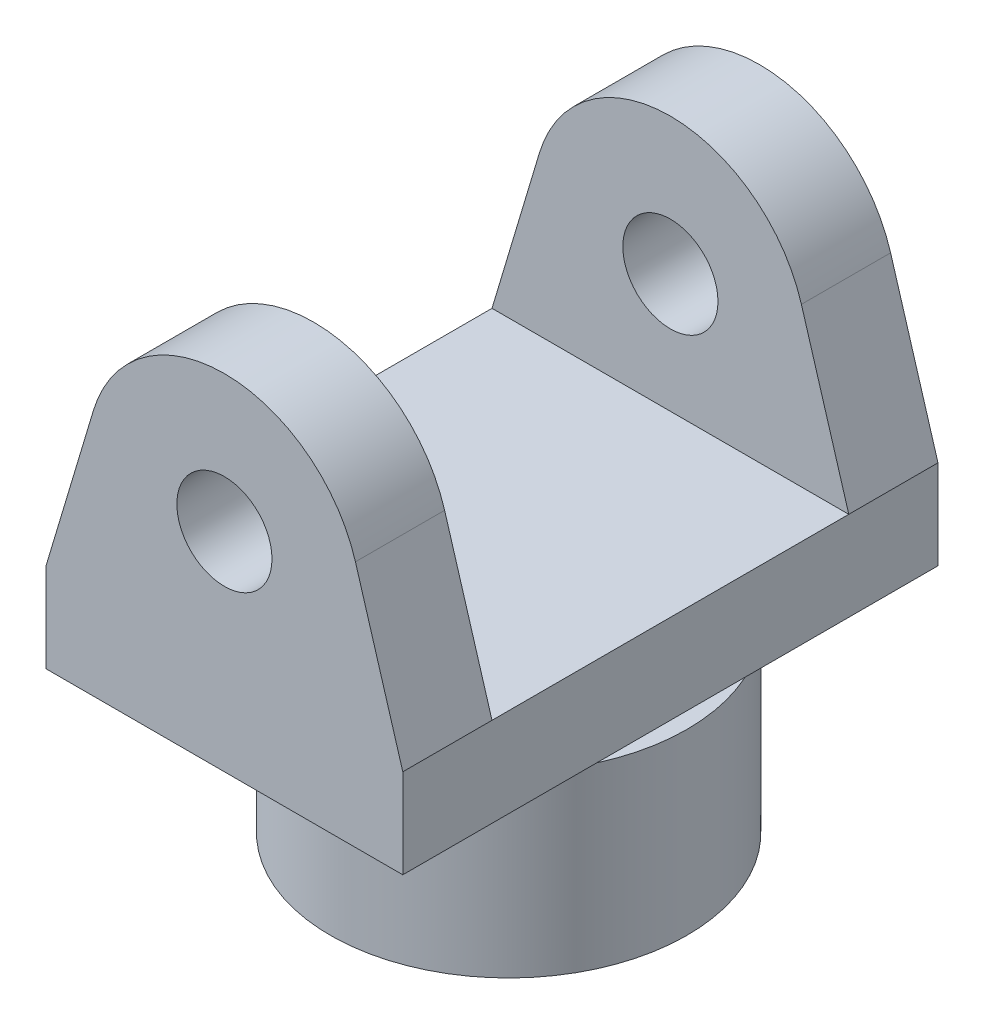
ISO-10303-21;
HEADER;
FILE_DESCRIPTION(('STEP AP214'),'2;1');
FILE_NAME('part.step','',(''),(''),'','','');
FILE_SCHEMA(('AUTOMOTIVE_DESIGN { 1 0 10303 214 1 1 1 1 }'));
ENDSEC;
DATA;
#1=APPLICATION_CONTEXT('core data for automotive mechanical design processes');
#2=APPLICATION_PROTOCOL_DEFINITION('international standard','automotive_design',2000,#1);
#3=PRODUCT_CONTEXT('',#1,'mechanical');
#4=PRODUCT('Part','Part','',(#3));
#5=PRODUCT_RELATED_PRODUCT_CATEGORY('part','',(#4));
#6=PRODUCT_DEFINITION_FORMATION('','',#4);
#7=PRODUCT_DEFINITION_CONTEXT('part definition',#1,'design');
#8=PRODUCT_DEFINITION('design','',#6,#7);
#9=PRODUCT_DEFINITION_SHAPE('','',#8);
#10=(LENGTH_UNIT() NAMED_UNIT(*) SI_UNIT(.MILLI.,.METRE.));
#11=(NAMED_UNIT(*) PLANE_ANGLE_UNIT() SI_UNIT($,.RADIAN.));
#12=(NAMED_UNIT(*) SI_UNIT($,.STERADIAN.) SOLID_ANGLE_UNIT());
#13=UNCERTAINTY_MEASURE_WITH_UNIT(LENGTH_MEASURE(1.E-05),#10,'distance_accuracy_value','');
#14=(GEOMETRIC_REPRESENTATION_CONTEXT(3) GLOBAL_UNCERTAINTY_ASSIGNED_CONTEXT((#13)) GLOBAL_UNIT_ASSIGNED_CONTEXT((#10,
#11,#12)) REPRESENTATION_CONTEXT('',''));
#15=CARTESIAN_POINT('',(0.,0.,0.));
#16=DIRECTION('',(0.,0.,1.));
#17=DIRECTION('',(1.,0.,0.));
#18=AXIS2_PLACEMENT_3D('',#15,#16,#17);
#19=CARTESIAN_POINT('',(0.,-20.,90.));
#20=DIRECTION('',(0.,1.,0.));
#21=DIRECTION('',(0.,0.,1.));
#22=AXIS2_PLACEMENT_3D('',#19,#20,#21);
#23=PLANE('',#22);
#24=DIRECTION('',(0.,0.,-1.));
#25=VECTOR('',#24,1.);
#26=CARTESIAN_POINT('',(-30.,-20.,90.));
#27=LINE('',#26,#25);
#28=CARTESIAN_POINT('',(-30.,-20.,75.));
#29=VERTEX_POINT('',#28);
#30=CARTESIAN_POINT('',(-30.,-20.,15.));
#31=VERTEX_POINT('',#30);
#32=EDGE_CURVE('E274',#29,#31,#27,.T.);
#33=ORIENTED_EDGE('',*,*,#32,.F.);
#34=DIRECTION('',(1.,0.,0.));
#35=VECTOR('',#34,1.);
#36=CARTESIAN_POINT('',(0.,-20.,75.));
#37=LINE('',#36,#35);
#38=CARTESIAN_POINT('',(30.,-20.,75.));
#39=VERTEX_POINT('',#38);
#40=EDGE_CURVE('E226',#29,#39,#37,.T.);
#41=ORIENTED_EDGE('',*,*,#40,.T.);
#42=DIRECTION('',(0.,0.,-1.));
#43=VECTOR('',#42,1.);
#44=CARTESIAN_POINT('',(30.,-20.,90.));
#45=LINE('',#44,#43);
#46=CARTESIAN_POINT('',(30.,-20.,15.));
#47=VERTEX_POINT('',#46);
#48=EDGE_CURVE('E279',#39,#47,#45,.T.);
#49=ORIENTED_EDGE('',*,*,#48,.T.);
#50=DIRECTION('',(1.,0.,0.));
#51=VECTOR('',#50,1.);
#52=CARTESIAN_POINT('',(0.,-20.,15.));
#53=LINE('',#52,#51);
#54=EDGE_CURVE('E306',#31,#47,#53,.T.);
#55=ORIENTED_EDGE('',*,*,#54,.F.);
#56=EDGE_LOOP('',(#33,#41,#49,#55));
#57=FACE_BOUND('',#56,.T.);
#58=ADVANCED_FACE('F41',(#57),#23,.T.);
#59=CARTESIAN_POINT('',(22.0328983898167,6.59934758472496,15.));
#60=DIRECTION('',(-0.957952103905071,-0.286928155857607,0.));
#61=DIRECTION('',(0.286928155857607,-0.957952103905071,0.));
#62=AXIS2_PLACEMENT_3D('',#59,#60,#61);
#63=PLANE('',#62);
#64=DIRECTION('',(-0.286928155857607,0.957952103905072,0.));
#65=VECTOR('',#64,1.);
#66=CARTESIAN_POINT('',(22.0328983898167,6.59934758472496,0.));
#67=LINE('',#66,#65);
#68=CARTESIAN_POINT('',(30.,-20.,0.));
#69=VERTEX_POINT('',#68);
#70=CARTESIAN_POINT('',(22.0328983898167,6.59934758472497,0.));
#71=VERTEX_POINT('',#70);
#72=EDGE_CURVE('E314',#69,#71,#67,.T.);
#73=ORIENTED_EDGE('',*,*,#72,.T.);
#74=DIRECTION('',(0.,0.,-1.));
#75=VECTOR('',#74,1.);
#76=CARTESIAN_POINT('',(22.0328983898167,6.59934758472497,15.));
#77=LINE('',#76,#75);
#78=CARTESIAN_POINT('',(22.0328983898167,6.59934758472497,15.));
#79=VERTEX_POINT('',#78);
#80=EDGE_CURVE('E45',#79,#71,#77,.T.);
#81=ORIENTED_EDGE('',*,*,#80,.F.);
#82=DIRECTION('',(-0.286928155857607,0.957952103905072,0.));
#83=VECTOR('',#82,1.);
#84=CARTESIAN_POINT('',(22.0328983898167,6.59934758472496,15.));
#85=LINE('',#84,#83);
#86=EDGE_CURVE('E294',#47,#79,#85,.T.);
#87=ORIENTED_EDGE('',*,*,#86,.F.);
#88=DIRECTION('',(0.,0.,-1.));
#89=VECTOR('',#88,1.);
#90=CARTESIAN_POINT('',(30.,-20.,15.));
#91=LINE('',#90,#89);
#92=EDGE_CURVE('E310',#47,#69,#91,.T.);
#93=ORIENTED_EDGE('',*,*,#92,.T.);
#94=EDGE_LOOP('',(#73,#81,#87,#93));
#95=FACE_BOUND('',#94,.T.);
#96=ADVANCED_FACE('F343',(#95),#63,.F.);
#97=CARTESIAN_POINT('',(0.,0.,15.));
#98=DIRECTION('',(0.,0.,-1.));
#99=DIRECTION('',(-1.,0.,0.));
#100=AXIS2_PLACEMENT_3D('',#97,#98,#99);
#101=CYLINDRICAL_SURFACE('',#100,23.);
#102=CARTESIAN_POINT('',(0.,0.,0.));
#103=DIRECTION('',(0.,0.,1.));
#104=DIRECTION('',(1.,0.,0.));
#105=AXIS2_PLACEMENT_3D('',#102,#103,#104);
#106=CIRCLE('',#105,23.);
#107=CARTESIAN_POINT('',(-22.0328983898167,6.59934758472497,0.));
#108=VERTEX_POINT('',#107);
#109=EDGE_CURVE('E318',#71,#108,#106,.T.);
#110=ORIENTED_EDGE('',*,*,#109,.T.);
#111=DIRECTION('',(0.,0.,-1.));
#112=VECTOR('',#111,1.);
#113=CARTESIAN_POINT('',(-22.0328983898167,6.59934758472497,15.));
#114=LINE('',#113,#112);
#115=CARTESIAN_POINT('',(-22.0328983898167,6.59934758472497,15.));
#116=VERTEX_POINT('',#115);
#117=EDGE_CURVE('E330',#116,#108,#114,.T.);
#118=ORIENTED_EDGE('',*,*,#117,.F.);
#119=CARTESIAN_POINT('',(0.,0.,15.));
#120=DIRECTION('',(0.,0.,1.));
#121=DIRECTION('',(1.,0.,0.));
#122=AXIS2_PLACEMENT_3D('',#119,#120,#121);
#123=CIRCLE('',#122,23.);
#124=EDGE_CURVE('E299',#79,#116,#123,.T.);
#125=ORIENTED_EDGE('',*,*,#124,.F.);
#126=ORIENTED_EDGE('',*,*,#80,.T.);
#127=EDGE_LOOP('',(#110,#118,#125,#126));
#128=FACE_BOUND('',#127,.T.);
#129=ADVANCED_FACE('F339',(#128),#101,.T.);
#130=CARTESIAN_POINT('',(-22.0328983898167,6.59934758472496,15.));
#131=DIRECTION('',(-0.957952103905071,0.286928155857607,0.));
#132=DIRECTION('',(-0.286928155857607,-0.957952103905072,0.));
#133=AXIS2_PLACEMENT_3D('',#130,#131,#132);
#134=PLANE('',#133);
#135=DIRECTION('',(0.286928155857607,0.957952103905072,0.));
#136=VECTOR('',#135,1.);
#137=CARTESIAN_POINT('',(-22.0328983898167,6.59934758472496,0.));
#138=LINE('',#137,#136);
#139=CARTESIAN_POINT('',(-30.,-20.,0.));
#140=VERTEX_POINT('',#139);
#141=EDGE_CURVE('E295',#140,#108,#138,.T.);
#142=ORIENTED_EDGE('',*,*,#141,.F.);
#143=DIRECTION('',(0.,0.,-1.));
#144=VECTOR('',#143,1.);
#145=CARTESIAN_POINT('',(-30.,-20.,15.));
#146=LINE('',#145,#144);
#147=EDGE_CURVE('E328',#31,#140,#146,.T.);
#148=ORIENTED_EDGE('',*,*,#147,.F.);
#149=DIRECTION('',(0.286928155857607,0.957952103905072,0.));
#150=VECTOR('',#149,1.);
#151=CARTESIAN_POINT('',(-22.0328983898167,6.59934758472496,15.));
#152=LINE('',#151,#150);
#153=EDGE_CURVE('E302',#31,#116,#152,.T.);
#154=ORIENTED_EDGE('',*,*,#153,.T.);
#155=ORIENTED_EDGE('',*,*,#117,.T.);
#156=EDGE_LOOP('',(#142,#148,#154,#155));
#157=FACE_BOUND('',#156,.T.);
#158=ADVANCED_FACE('F351',(#157),#134,.T.);
#159=CARTESIAN_POINT('',(0.,0.,15.));
#160=DIRECTION('',(0.,0.,-1.));
#161=DIRECTION('',(-1.,0.,0.));
#162=AXIS2_PLACEMENT_3D('',#159,#160,#161);
#163=CYLINDRICAL_SURFACE('',#162,8.);
#164=CARTESIAN_POINT('',(0.,0.,15.));
#165=DIRECTION('',(0.,0.,1.));
#166=DIRECTION('',(1.,0.,0.));
#167=AXIS2_PLACEMENT_3D('',#164,#165,#166);
#168=CIRCLE('',#167,8.);
#169=CARTESIAN_POINT('',(8.,0.,15.));
#170=VERTEX_POINT('',#169);
#171=EDGE_CURVE('E290',#170,#170,#168,.T.);
#172=ORIENTED_EDGE('',*,*,#171,.T.);
#173=EDGE_LOOP('',(#172));
#174=FACE_BOUND('',#173,.T.);
#175=CARTESIAN_POINT('',(0.,0.,0.));
#176=DIRECTION('',(0.,0.,1.));
#177=DIRECTION('',(1.,0.,0.));
#178=AXIS2_PLACEMENT_3D('',#175,#176,#177);
#179=CIRCLE('',#178,8.);
#180=CARTESIAN_POINT('',(8.,0.,0.));
#181=VERTEX_POINT('',#180);
#182=EDGE_CURVE('E288',#181,#181,#179,.T.);
#183=ORIENTED_EDGE('',*,*,#182,.F.);
#184=EDGE_LOOP('',(#183));
#185=FACE_BOUND('',#184,.T.);
#186=ADVANCED_FACE('F43',(#174,#185),#163,.F.);
#187=CARTESIAN_POINT('',(0.,0.,15.));
#188=DIRECTION('',(0.,0.,1.));
#189=DIRECTION('',(1.,0.,0.));
#190=AXIS2_PLACEMENT_3D('',#187,#188,#189);
#191=PLANE('',#190);
#192=ORIENTED_EDGE('',*,*,#171,.F.);
#193=EDGE_LOOP('',(#192));
#194=FACE_BOUND('',#193,.T.);
#195=ORIENTED_EDGE('',*,*,#86,.T.);
#196=ORIENTED_EDGE('',*,*,#124,.T.);
#197=ORIENTED_EDGE('',*,*,#153,.F.);
#198=ORIENTED_EDGE('',*,*,#54,.T.);
#199=EDGE_LOOP('',(#195,#196,#197,#198));
#200=FACE_BOUND('',#199,.T.);
#201=ADVANCED_FACE('F355',(#194,#200),#191,.T.);
#202=CARTESIAN_POINT('',(0.,0.,0.));
#203=DIRECTION('',(0.,0.,1.));
#204=DIRECTION('',(1.,0.,0.));
#205=AXIS2_PLACEMENT_3D('',#202,#203,#204);
#206=PLANE('',#205);
#207=ORIENTED_EDGE('',*,*,#182,.T.);
#208=EDGE_LOOP('',(#207));
#209=FACE_BOUND('',#208,.T.);
#210=ORIENTED_EDGE('',*,*,#72,.F.);
#211=DIRECTION('',(0.,1.,0.));
#212=VECTOR('',#211,1.);
#213=CARTESIAN_POINT('',(30.,0.,0.));
#214=LINE('',#213,#212);
#215=CARTESIAN_POINT('',(30.,-35.,0.));
#216=VERTEX_POINT('',#215);
#217=EDGE_CURVE('E266',#216,#69,#214,.T.);
#218=ORIENTED_EDGE('',*,*,#217,.F.);
#219=DIRECTION('',(1.,0.,0.));
#220=VECTOR('',#219,1.);
#221=CARTESIAN_POINT('',(0.,-35.,0.));
#222=LINE('',#221,#220);
#223=CARTESIAN_POINT('',(-30.,-35.,0.));
#224=VERTEX_POINT('',#223);
#225=EDGE_CURVE('E247',#224,#216,#222,.T.);
#226=ORIENTED_EDGE('',*,*,#225,.F.);
#227=DIRECTION('',(0.,1.,0.));
#228=VECTOR('',#227,1.);
#229=CARTESIAN_POINT('',(-30.,0.,0.));
#230=LINE('',#229,#228);
#231=EDGE_CURVE('E255',#224,#140,#230,.T.);
#232=ORIENTED_EDGE('',*,*,#231,.T.);
#233=ORIENTED_EDGE('',*,*,#141,.T.);
#234=ORIENTED_EDGE('',*,*,#109,.F.);
#235=EDGE_LOOP('',(#210,#218,#226,#232,#233,#234));
#236=FACE_BOUND('',#235,.T.);
#237=ADVANCED_FACE('F347',(#209,#236),#206,.F.);
#238=CARTESIAN_POINT('',(0.,-35.,90.));
#239=DIRECTION('',(0.,1.,0.));
#240=DIRECTION('',(0.,0.,1.));
#241=AXIS2_PLACEMENT_3D('',#238,#239,#240);
#242=PLANE('',#241);
#243=CARTESIAN_POINT('',(2.72086676659588,-35.,44.9176678383733));
#244=DIRECTION('',(0.,-1.,0.));
#245=DIRECTION('',(0.,0.,-1.));
#246=AXIS2_PLACEMENT_3D('',#243,#244,#245);
#247=CIRCLE('',#246,30.);
#248=CARTESIAN_POINT('',(30.,-35.,57.4016131295938));
#249=VERTEX_POINT('',#248);
#250=CARTESIAN_POINT('',(30.,-35.,32.4337225471528));
#251=VERTEX_POINT('',#250);
#252=EDGE_CURVE('E11',#249,#251,#247,.T.);
#253=ORIENTED_EDGE('',*,*,#252,.F.);
#254=DIRECTION('',(0.,0.,-1.));
#255=VECTOR('',#254,1.);
#256=CARTESIAN_POINT('',(30.,-35.,90.));
#257=LINE('',#256,#255);
#258=CARTESIAN_POINT('',(30.,-35.,90.));
#259=VERTEX_POINT('',#258);
#260=EDGE_CURVE('E285',#259,#249,#257,.T.);
#261=ORIENTED_EDGE('',*,*,#260,.F.);
#262=DIRECTION('',(1.,0.,0.));
#263=VECTOR('',#262,1.);
#264=CARTESIAN_POINT('',(0.,-35.,90.));
#265=LINE('',#264,#263);
#266=CARTESIAN_POINT('',(-30.,-35.,90.));
#267=VERTEX_POINT('',#266);
#268=EDGE_CURVE('E250',#267,#259,#265,.T.);
#269=ORIENTED_EDGE('',*,*,#268,.F.);
#270=DIRECTION('',(0.,0.,-1.));
#271=VECTOR('',#270,1.);
#272=CARTESIAN_POINT('',(-30.,-35.,90.));
#273=LINE('',#272,#271);
#274=EDGE_CURVE('E262',#267,#224,#273,.T.);
#275=ORIENTED_EDGE('',*,*,#274,.T.);
#276=ORIENTED_EDGE('',*,*,#225,.T.);
#277=EDGE_CURVE('E284',#251,#216,#257,.T.);
#278=ORIENTED_EDGE('',*,*,#277,.F.);
#279=EDGE_LOOP('',(#253,#261,#269,#275,#276,#278));
#280=FACE_BOUND('',#279,.T.);
#281=ADVANCED_FACE('F387',(#280),#242,.F.);
#282=CARTESIAN_POINT('',(30.,0.,90.));
#283=DIRECTION('',(-1.,0.,0.));
#284=DIRECTION('',(0.,-1.,0.));
#285=AXIS2_PLACEMENT_3D('',#282,#283,#284);
#286=PLANE('',#285);
#287=ORIENTED_EDGE('',*,*,#217,.T.);
#288=ORIENTED_EDGE('',*,*,#92,.F.);
#289=ORIENTED_EDGE('',*,*,#48,.F.);
#290=CARTESIAN_POINT('',(30.,-20.,90.));
#291=VERTEX_POINT('',#290);
#292=EDGE_CURVE('E280',#291,#39,#45,.T.);
#293=ORIENTED_EDGE('',*,*,#292,.F.);
#294=DIRECTION('',(0.,1.,0.));
#295=VECTOR('',#294,1.);
#296=CARTESIAN_POINT('',(30.,0.,90.));
#297=LINE('',#296,#295);
#298=EDGE_CURVE('E254',#259,#291,#297,.T.);
#299=ORIENTED_EDGE('',*,*,#298,.F.);
#300=ORIENTED_EDGE('',*,*,#260,.T.);
#301=EDGE_CURVE('E289',#249,#251,#257,.T.);
#302=ORIENTED_EDGE('',*,*,#301,.T.);
#303=ORIENTED_EDGE('',*,*,#277,.T.);
#304=EDGE_LOOP('',(#287,#288,#289,#293,#299,#300,#302,#303));
#305=FACE_BOUND('',#304,.T.);
#306=ADVANCED_FACE('F362',(#305),#286,.F.);
#307=CARTESIAN_POINT('',(-30.,0.,90.));
#308=DIRECTION('',(-1.,0.,0.));
#309=DIRECTION('',(0.,-1.,0.));
#310=AXIS2_PLACEMENT_3D('',#307,#308,#309);
#311=PLANE('',#310);
#312=ORIENTED_EDGE('',*,*,#231,.F.);
#313=ORIENTED_EDGE('',*,*,#274,.F.);
#314=DIRECTION('',(0.,1.,0.));
#315=VECTOR('',#314,1.);
#316=CARTESIAN_POINT('',(-30.,0.,90.));
#317=LINE('',#316,#315);
#318=CARTESIAN_POINT('',(-30.,-20.,90.));
#319=VERTEX_POINT('',#318);
#320=EDGE_CURVE('E259',#267,#319,#317,.T.);
#321=ORIENTED_EDGE('',*,*,#320,.T.);
#322=EDGE_CURVE('E275',#319,#29,#27,.T.);
#323=ORIENTED_EDGE('',*,*,#322,.T.);
#324=ORIENTED_EDGE('',*,*,#32,.T.);
#325=ORIENTED_EDGE('',*,*,#147,.T.);
#326=EDGE_LOOP('',(#312,#313,#321,#323,#324,#325));
#327=FACE_BOUND('',#326,.T.);
#328=ADVANCED_FACE('F367',(#327),#311,.T.);
#329=CARTESIAN_POINT('',(0.,0.,90.));
#330=DIRECTION('',(0.,0.,1.));
#331=DIRECTION('',(1.,0.,0.));
#332=AXIS2_PLACEMENT_3D('',#329,#330,#331);
#333=PLANE('',#332);
#334=ORIENTED_EDGE('',*,*,#268,.T.);
#335=ORIENTED_EDGE('',*,*,#298,.T.);
#336=DIRECTION('',(-0.286928155857607,0.957952103905072,0.));
#337=VECTOR('',#336,1.);
#338=CARTESIAN_POINT('',(22.0328983898167,6.59934758472497,90.));
#339=LINE('',#338,#337);
#340=CARTESIAN_POINT('',(22.0328983898167,6.59934758472497,90.));
#341=VERTEX_POINT('',#340);
#342=EDGE_CURVE('E233',#291,#341,#339,.T.);
#343=ORIENTED_EDGE('',*,*,#342,.T.);
#344=CARTESIAN_POINT('',(0.,0.,90.));
#345=DIRECTION('',(0.,0.,1.));
#346=DIRECTION('',(1.,0.,0.));
#347=AXIS2_PLACEMENT_3D('',#344,#345,#346);
#348=CIRCLE('',#347,23.);
#349=CARTESIAN_POINT('',(-22.0328983898167,6.59934758472497,90.));
#350=VERTEX_POINT('',#349);
#351=EDGE_CURVE('E237',#341,#350,#348,.T.);
#352=ORIENTED_EDGE('',*,*,#351,.T.);
#353=DIRECTION('',(0.286928155857607,0.957952103905072,0.));
#354=VECTOR('',#353,1.);
#355=CARTESIAN_POINT('',(-22.0328983898167,6.59934758472496,90.));
#356=LINE('',#355,#354);
#357=EDGE_CURVE('E215',#319,#350,#356,.T.);
#358=ORIENTED_EDGE('',*,*,#357,.F.);
#359=ORIENTED_EDGE('',*,*,#320,.F.);
#360=EDGE_LOOP('',(#334,#335,#343,#352,#358,#359));
#361=FACE_BOUND('',#360,.T.);
#362=CARTESIAN_POINT('',(0.,0.,90.));
#363=DIRECTION('',(0.,0.,1.));
#364=DIRECTION('',(1.,0.,0.));
#365=AXIS2_PLACEMENT_3D('',#362,#363,#364);
#366=CIRCLE('',#365,8.);
#367=CARTESIAN_POINT('',(8.,0.,90.));
#368=VERTEX_POINT('',#367);
#369=EDGE_CURVE('E206',#368,#368,#366,.T.);
#370=ORIENTED_EDGE('',*,*,#369,.F.);
#371=EDGE_LOOP('',(#370));
#372=FACE_BOUND('',#371,.T.);
#373=ADVANCED_FACE('F384',(#361,#372),#333,.T.);
#374=CARTESIAN_POINT('',(22.0328983898167,6.59934758472497,75.));
#375=DIRECTION('',(0.957952103905071,0.286928155857607,0.));
#376=DIRECTION('',(-0.286928155857607,0.957952103905071,0.));
#377=AXIS2_PLACEMENT_3D('',#374,#375,#376);
#378=PLANE('',#377);
#379=ORIENTED_EDGE('',*,*,#342,.F.);
#380=ORIENTED_EDGE('',*,*,#292,.T.);
#381=DIRECTION('',(-0.286928155857607,0.957952103905072,0.));
#382=VECTOR('',#381,1.);
#383=CARTESIAN_POINT('',(22.0328983898167,6.59934758472497,75.));
#384=LINE('',#383,#382);
#385=CARTESIAN_POINT('',(22.0328983898167,6.59934758472497,75.));
#386=VERTEX_POINT('',#385);
#387=EDGE_CURVE('E214',#39,#386,#384,.T.);
#388=ORIENTED_EDGE('',*,*,#387,.T.);
#389=DIRECTION('',(0.,0.,1.));
#390=VECTOR('',#389,1.);
#391=CARTESIAN_POINT('',(22.0328983898167,6.59934758472497,75.));
#392=LINE('',#391,#390);
#393=EDGE_CURVE('E229',#386,#341,#392,.T.);
#394=ORIENTED_EDGE('',*,*,#393,.T.);
#395=EDGE_LOOP('',(#379,#380,#388,#394));
#396=FACE_BOUND('',#395,.T.);
#397=ADVANCED_FACE('F381',(#396),#378,.T.);
#398=CARTESIAN_POINT('',(-22.0328983898167,6.59934758472496,75.));
#399=DIRECTION('',(0.957952103905071,-0.286928155857607,0.));
#400=DIRECTION('',(0.286928155857607,0.957952103905072,0.));
#401=AXIS2_PLACEMENT_3D('',#398,#399,#400);
#402=PLANE('',#401);
#403=ORIENTED_EDGE('',*,*,#357,.T.);
#404=DIRECTION('',(0.,0.,1.));
#405=VECTOR('',#404,1.);
#406=CARTESIAN_POINT('',(-22.0328983898167,6.59934758472497,75.));
#407=LINE('',#406,#405);
#408=CARTESIAN_POINT('',(-22.0328983898167,6.59934758472497,75.));
#409=VERTEX_POINT('',#408);
#410=EDGE_CURVE('E244',#409,#350,#407,.T.);
#411=ORIENTED_EDGE('',*,*,#410,.F.);
#412=DIRECTION('',(0.286928155857607,0.957952103905072,0.));
#413=VECTOR('',#412,1.);
#414=CARTESIAN_POINT('',(-22.0328983898167,6.59934758472496,75.));
#415=LINE('',#414,#413);
#416=EDGE_CURVE('E223',#29,#409,#415,.T.);
#417=ORIENTED_EDGE('',*,*,#416,.F.);
#418=ORIENTED_EDGE('',*,*,#322,.F.);
#419=EDGE_LOOP('',(#403,#411,#417,#418));
#420=FACE_BOUND('',#419,.T.);
#421=ADVANCED_FACE('F374',(#420),#402,.F.);
#422=CARTESIAN_POINT('',(0.,0.,75.));
#423=DIRECTION('',(0.,0.,1.));
#424=DIRECTION('',(1.,0.,0.));
#425=AXIS2_PLACEMENT_3D('',#422,#423,#424);
#426=CYLINDRICAL_SURFACE('',#425,8.);
#427=CARTESIAN_POINT('',(0.,0.,75.));
#428=DIRECTION('',(0.,0.,1.));
#429=DIRECTION('',(1.,0.,0.));
#430=AXIS2_PLACEMENT_3D('',#427,#428,#429);
#431=CIRCLE('',#430,8.);
#432=CARTESIAN_POINT('',(8.,0.,75.));
#433=VERTEX_POINT('',#432);
#434=EDGE_CURVE('E210',#433,#433,#431,.T.);
#435=ORIENTED_EDGE('',*,*,#434,.F.);
#436=EDGE_LOOP('',(#435));
#437=FACE_BOUND('',#436,.T.);
#438=ORIENTED_EDGE('',*,*,#369,.T.);
#439=EDGE_LOOP('',(#438));
#440=FACE_BOUND('',#439,.T.);
#441=ADVANCED_FACE('F480',(#437,#440),#426,.F.);
#442=CARTESIAN_POINT('',(0.,0.,75.));
#443=DIRECTION('',(0.,0.,1.));
#444=DIRECTION('',(1.,0.,0.));
#445=AXIS2_PLACEMENT_3D('',#442,#443,#444);
#446=CYLINDRICAL_SURFACE('',#445,23.);
#447=ORIENTED_EDGE('',*,*,#351,.F.);
#448=ORIENTED_EDGE('',*,*,#393,.F.);
#449=CARTESIAN_POINT('',(0.,0.,75.));
#450=DIRECTION('',(0.,0.,1.));
#451=DIRECTION('',(1.,0.,0.));
#452=AXIS2_PLACEMENT_3D('',#449,#450,#451);
#453=CIRCLE('',#452,23.);
#454=EDGE_CURVE('E219',#386,#409,#453,.T.);
#455=ORIENTED_EDGE('',*,*,#454,.T.);
#456=ORIENTED_EDGE('',*,*,#410,.T.);
#457=EDGE_LOOP('',(#447,#448,#455,#456));
#458=FACE_BOUND('',#457,.T.);
#459=ADVANCED_FACE('F487',(#458),#446,.T.);
#460=CARTESIAN_POINT('',(0.,0.,75.));
#461=DIRECTION('',(0.,0.,1.));
#462=DIRECTION('',(1.,0.,0.));
#463=AXIS2_PLACEMENT_3D('',#460,#461,#462);
#464=PLANE('',#463);
#465=ORIENTED_EDGE('',*,*,#434,.T.);
#466=EDGE_LOOP('',(#465));
#467=FACE_BOUND('',#466,.T.);
#468=ORIENTED_EDGE('',*,*,#387,.F.);
#469=ORIENTED_EDGE('',*,*,#40,.F.);
#470=ORIENTED_EDGE('',*,*,#416,.T.);
#471=ORIENTED_EDGE('',*,*,#454,.F.);
#472=EDGE_LOOP('',(#468,#469,#470,#471));
#473=FACE_BOUND('',#472,.T.);
#474=ADVANCED_FACE('F378',(#467,#473),#464,.F.);
#475=CARTESIAN_POINT('',(2.72086676659588,-65.,44.9176678383733));
#476=DIRECTION('',(0.,-1.,0.));
#477=DIRECTION('',(0.,0.,-1.));
#478=AXIS2_PLACEMENT_3D('',#475,#476,#477);
#479=PLANE('',#478);
#480=CARTESIAN_POINT('',(2.72086676659588,-65.,44.9176678383733));
#481=DIRECTION('',(0.,-1.,0.));
#482=DIRECTION('',(0.,0.,-1.));
#483=AXIS2_PLACEMENT_3D('',#480,#481,#482);
#484=CIRCLE('',#483,30.);
#485=CARTESIAN_POINT('',(2.72086676659588,-65.,14.9176678383733));
#486=VERTEX_POINT('',#485);
#487=EDGE_CURVE('E203',#486,#486,#484,.T.);
#488=ORIENTED_EDGE('',*,*,#487,.T.);
#489=EDGE_LOOP('',(#488));
#490=FACE_BOUND('',#489,.T.);
#491=DIRECTION('',(-1.,0.,0.));
#492=VECTOR('',#491,1.);
#493=CARTESIAN_POINT('',(-2.27913323340412,-65.,64.4176678383733));
#494=LINE('',#493,#492);
#495=CARTESIAN_POINT('',(7.72086676659588,-65.,64.4176678383733));
#496=VERTEX_POINT('',#495);
#497=CARTESIAN_POINT('',(-2.27913323340412,-65.,64.4176678383733));
#498=VERTEX_POINT('',#497);
#499=EDGE_CURVE('E161',#496,#498,#494,.T.);
#500=ORIENTED_EDGE('',*,*,#499,.F.);
#501=DIRECTION('',(0.,0.,1.));
#502=VECTOR('',#501,1.);
#503=CARTESIAN_POINT('',(7.72086676659588,-65.,58.561813923615));
#504=LINE('',#503,#502);
#505=CARTESIAN_POINT('',(7.72086676659587,-65.,58.561813923615));
#506=VERTEX_POINT('',#505);
#507=EDGE_CURVE('E152',#506,#496,#504,.T.);
#508=ORIENTED_EDGE('',*,*,#507,.F.);
#509=CARTESIAN_POINT('',(2.72086676659588,-65.,44.9176678383733));
#510=DIRECTION('',(0.,-1.,0.));
#511=DIRECTION('',(0.,0.,-1.));
#512=AXIS2_PLACEMENT_3D('',#509,#510,#511);
#513=CIRCLE('',#512,14.5314391026978);
#514=CARTESIAN_POINT('',(-2.27913323340412,-65.,58.561813923615));
#515=VERTEX_POINT('',#514);
#516=EDGE_CURVE('E179',#515,#506,#513,.T.);
#517=ORIENTED_EDGE('',*,*,#516,.F.);
#518=DIRECTION('',(0.,0.,-1.));
#519=VECTOR('',#518,1.);
#520=CARTESIAN_POINT('',(-2.27913323340412,-65.,58.561813923615));
#521=LINE('',#520,#519);
#522=EDGE_CURVE('E175',#498,#515,#521,.T.);
#523=ORIENTED_EDGE('',*,*,#522,.F.);
#524=EDGE_LOOP('',(#500,#508,#517,#523));
#525=FACE_BOUND('',#524,.T.);
#526=ADVANCED_FACE('F173',(#490,#525),#479,.T.);
#527=CARTESIAN_POINT('',(2.72086676659588,-35.,44.9176678383733));
#528=DIRECTION('',(0.,-1.,0.));
#529=DIRECTION('',(0.,0.,-1.));
#530=AXIS2_PLACEMENT_3D('',#527,#528,#529);
#531=PLANE('',#530);
#532=ORIENTED_EDGE('',*,*,#301,.F.);
#533=EDGE_CURVE('E52',#251,#249,#247,.T.);
#534=ORIENTED_EDGE('',*,*,#533,.F.);
#535=EDGE_LOOP('',(#532,#534));
#536=FACE_BOUND('',#535,.T.);
#537=ADVANCED_FACE('F390',(#536),#531,.F.);
#538=CARTESIAN_POINT('',(2.72086676659588,-65.,44.9176678383733));
#539=DIRECTION('',(0.,1.,0.));
#540=DIRECTION('',(0.,0.,1.));
#541=AXIS2_PLACEMENT_3D('',#538,#539,#540);
#542=CYLINDRICAL_SURFACE('',#541,30.);
#543=ORIENTED_EDGE('',*,*,#487,.F.);
#544=EDGE_LOOP('',(#543));
#545=FACE_BOUND('',#544,.T.);
#546=ORIENTED_EDGE('',*,*,#533,.T.);
#547=ORIENTED_EDGE('',*,*,#252,.T.);
#548=EDGE_LOOP('',(#546,#547));
#549=FACE_BOUND('',#548,.T.);
#550=ADVANCED_FACE('F392',(#545,#549),#542,.T.);
#551=CARTESIAN_POINT('',(7.72086676659588,-65.,58.561813923615));
#552=DIRECTION('',(-1.,0.,0.));
#553=DIRECTION('',(0.,0.,1.));
#554=AXIS2_PLACEMENT_3D('',#551,#552,#553);
#555=PLANE('',#554);
#556=DIRECTION('',(0.,0.,1.));
#557=VECTOR('',#556,1.);
#558=CARTESIAN_POINT('',(7.72086676659588,-35.,58.561813923615));
#559=LINE('',#558,#557);
#560=CARTESIAN_POINT('',(7.72086676659587,-35.,58.561813923615));
#561=VERTEX_POINT('',#560);
#562=CARTESIAN_POINT('',(7.72086676659588,-35.,64.4176678383733));
#563=VERTEX_POINT('',#562);
#564=EDGE_CURVE('E184',#561,#563,#559,.T.);
#565=ORIENTED_EDGE('',*,*,#564,.F.);
#566=DIRECTION('',(0.,1.,0.));
#567=VECTOR('',#566,1.);
#568=CARTESIAN_POINT('',(7.72086676659587,-65.,58.561813923615));
#569=LINE('',#568,#567);
#570=EDGE_CURVE('E59',#506,#561,#569,.T.);
#571=ORIENTED_EDGE('',*,*,#570,.F.);
#572=ORIENTED_EDGE('',*,*,#507,.T.);
#573=DIRECTION('',(0.,1.,0.));
#574=VECTOR('',#573,1.);
#575=CARTESIAN_POINT('',(7.72086676659588,-65.,64.4176678383733));
#576=LINE('',#575,#574);
#577=EDGE_CURVE('E155',#496,#563,#576,.T.);
#578=ORIENTED_EDGE('',*,*,#577,.T.);
#579=EDGE_LOOP('',(#565,#571,#572,#578));
#580=FACE_BOUND('',#579,.T.);
#581=ADVANCED_FACE('F154',(#580),#555,.T.);
#582=CARTESIAN_POINT('',(-2.27913323340412,-65.,64.4176678383733));
#583=DIRECTION('',(0.,0.,-1.));
#584=DIRECTION('',(-1.,0.,0.));
#585=AXIS2_PLACEMENT_3D('',#582,#583,#584);
#586=PLANE('',#585);
#587=DIRECTION('',(-1.,0.,0.));
#588=VECTOR('',#587,1.);
#589=CARTESIAN_POINT('',(-2.27913323340412,-35.,64.4176678383733));
#590=LINE('',#589,#588);
#591=CARTESIAN_POINT('',(-2.27913323340412,-35.,64.4176678383733));
#592=VERTEX_POINT('',#591);
#593=EDGE_CURVE('E168',#563,#592,#590,.T.);
#594=ORIENTED_EDGE('',*,*,#593,.F.);
#595=ORIENTED_EDGE('',*,*,#577,.F.);
#596=ORIENTED_EDGE('',*,*,#499,.T.);
#597=DIRECTION('',(0.,1.,0.));
#598=VECTOR('',#597,1.);
#599=CARTESIAN_POINT('',(-2.27913323340412,-65.,64.4176678383733));
#600=LINE('',#599,#598);
#601=EDGE_CURVE('E170',#498,#592,#600,.T.);
#602=ORIENTED_EDGE('',*,*,#601,.T.);
#603=EDGE_LOOP('',(#594,#595,#596,#602));
#604=FACE_BOUND('',#603,.T.);
#605=ADVANCED_FACE('F165',(#604),#586,.T.);
#606=CARTESIAN_POINT('',(-2.27913323340412,-65.,58.561813923615));
#607=DIRECTION('',(1.,0.,0.));
#608=DIRECTION('',(0.,0.,-1.));
#609=AXIS2_PLACEMENT_3D('',#606,#607,#608);
#610=PLANE('',#609);
#611=DIRECTION('',(0.,0.,-1.));
#612=VECTOR('',#611,1.);
#613=CARTESIAN_POINT('',(-2.27913323340412,-35.,58.561813923615));
#614=LINE('',#613,#612);
#615=CARTESIAN_POINT('',(-2.27913323340412,-35.,58.561813923615));
#616=VERTEX_POINT('',#615);
#617=EDGE_CURVE('E189',#592,#616,#614,.T.);
#618=ORIENTED_EDGE('',*,*,#617,.F.);
#619=ORIENTED_EDGE('',*,*,#601,.F.);
#620=ORIENTED_EDGE('',*,*,#522,.T.);
#621=DIRECTION('',(0.,1.,0.));
#622=VECTOR('',#621,1.);
#623=CARTESIAN_POINT('',(-2.27913323340412,-65.,58.561813923615));
#624=LINE('',#623,#622);
#625=EDGE_CURVE('E198',#515,#616,#624,.T.);
#626=ORIENTED_EDGE('',*,*,#625,.T.);
#627=EDGE_LOOP('',(#618,#619,#620,#626));
#628=FACE_BOUND('',#627,.T.);
#629=ADVANCED_FACE('F530',(#628),#610,.T.);
#630=CARTESIAN_POINT('',(2.72086676659588,-65.,44.9176678383733));
#631=DIRECTION('',(0.,1.,0.));
#632=DIRECTION('',(0.,0.,1.));
#633=AXIS2_PLACEMENT_3D('',#630,#631,#632);
#634=CYLINDRICAL_SURFACE('',#633,14.5314391026978);
#635=CARTESIAN_POINT('',(2.72086676659588,-35.,44.9176678383733));
#636=DIRECTION('',(0.,-1.,0.));
#637=DIRECTION('',(0.,0.,-1.));
#638=AXIS2_PLACEMENT_3D('',#635,#636,#637);
#639=CIRCLE('',#638,14.5314391026978);
#640=EDGE_CURVE('E162',#616,#561,#639,.T.);
#641=ORIENTED_EDGE('',*,*,#640,.F.);
#642=ORIENTED_EDGE('',*,*,#625,.F.);
#643=ORIENTED_EDGE('',*,*,#516,.T.);
#644=ORIENTED_EDGE('',*,*,#570,.T.);
#645=EDGE_LOOP('',(#641,#642,#643,#644));
#646=FACE_BOUND('',#645,.T.);
#647=ADVANCED_FACE('F539',(#646),#634,.F.);
#648=ORIENTED_EDGE('',*,*,#640,.T.);
#649=ORIENTED_EDGE('',*,*,#564,.T.);
#650=ORIENTED_EDGE('',*,*,#593,.T.);
#651=ORIENTED_EDGE('',*,*,#617,.T.);
#652=EDGE_LOOP('',(#648,#649,#650,#651));
#653=FACE_BOUND('',#652,.T.);
#654=ADVANCED_FACE('F416',(#653),#242,.F.);
#655=CLOSED_SHELL('',(#58,#96,#129,#158,#186,#201,#237,#281,#306,#328,#373,#397,#421,#441,#459,
#474,#526,#537,#550,#581,#605,#629,#647,#654));
#656=MANIFOLD_SOLID_BREP('B2',#655);
#657=ADVANCED_BREP_SHAPE_REPRESENTATION('',(#18,#656),#14);
#658=SHAPE_DEFINITION_REPRESENTATION(#9,#657);
ENDSEC;
END-ISO-10303-21;
